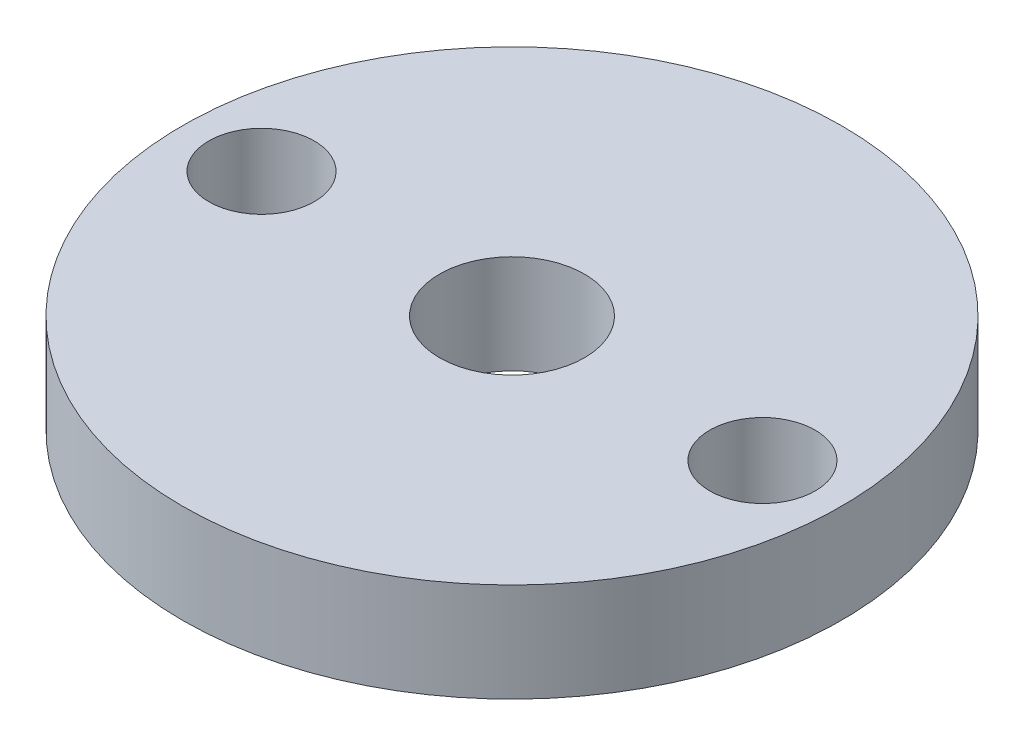
ISO-10303-21;
HEADER;
FILE_DESCRIPTION(('STEP AP214'),'2;1');
FILE_NAME('part.step','',(''),(''),'','','');
FILE_SCHEMA(('AUTOMOTIVE_DESIGN { 1 0 10303 214 1 1 1 1 }'));
ENDSEC;
DATA;
#1=APPLICATION_CONTEXT('core data for automotive mechanical design processes');
#2=APPLICATION_PROTOCOL_DEFINITION('international standard','automotive_design',2000,#1);
#3=PRODUCT_CONTEXT('',#1,'mechanical');
#4=PRODUCT('Part','Part','',(#3));
#5=PRODUCT_RELATED_PRODUCT_CATEGORY('part','',(#4));
#6=PRODUCT_DEFINITION_FORMATION('','',#4);
#7=PRODUCT_DEFINITION_CONTEXT('part definition',#1,'design');
#8=PRODUCT_DEFINITION('design','',#6,#7);
#9=PRODUCT_DEFINITION_SHAPE('','',#8);
#10=(LENGTH_UNIT() NAMED_UNIT(*) SI_UNIT(.MILLI.,.METRE.));
#11=(NAMED_UNIT(*) PLANE_ANGLE_UNIT() SI_UNIT($,.RADIAN.));
#12=(NAMED_UNIT(*) SI_UNIT($,.STERADIAN.) SOLID_ANGLE_UNIT());
#13=UNCERTAINTY_MEASURE_WITH_UNIT(LENGTH_MEASURE(1.E-05),#10,'distance_accuracy_value','');
#14=(GEOMETRIC_REPRESENTATION_CONTEXT(3) GLOBAL_UNCERTAINTY_ASSIGNED_CONTEXT((#13)) GLOBAL_UNIT_ASSIGNED_CONTEXT((#10,
#11,#12)) REPRESENTATION_CONTEXT('',''));
#15=CARTESIAN_POINT('',(0.,0.,0.));
#16=DIRECTION('',(0.,0.,1.));
#17=DIRECTION('',(1.,0.,0.));
#18=AXIS2_PLACEMENT_3D('',#15,#16,#17);
#19=CARTESIAN_POINT('',(-19.,7.5,0.));
#20=DIRECTION('',(0.,-1.,0.));
#21=DIRECTION('',(0.,0.,-1.));
#22=AXIS2_PLACEMENT_3D('',#19,#20,#21);
#23=CYLINDRICAL_SURFACE('',#22,1.8);
#24=CARTESIAN_POINT('',(-19.,0.,0.));
#25=DIRECTION('',(0.,1.,0.));
#26=DIRECTION('',(0.,0.,1.));
#27=AXIS2_PLACEMENT_3D('',#24,#25,#26);
#28=CIRCLE('',#27,1.8);
#29=CARTESIAN_POINT('',(-19.,0.,1.8));
#30=VERTEX_POINT('',#29);
#31=EDGE_CURVE('E58',#30,#30,#28,.T.);
#32=ORIENTED_EDGE('',*,*,#31,.F.);
#33=EDGE_LOOP('',(#32));
#34=FACE_BOUND('',#33,.T.);
#35=CARTESIAN_POINT('',(-19.,1.5,0.));
#36=DIRECTION('',(0.,1.,0.));
#37=DIRECTION('',(0.,0.,1.));
#38=AXIS2_PLACEMENT_3D('',#35,#36,#37);
#39=CIRCLE('',#38,1.8);
#40=CARTESIAN_POINT('',(-19.,1.5,1.8));
#41=VERTEX_POINT('',#40);
#42=EDGE_CURVE('E47',#41,#41,#39,.T.);
#43=ORIENTED_EDGE('',*,*,#42,.T.);
#44=EDGE_LOOP('',(#43));
#45=FACE_BOUND('',#44,.T.);
#46=ADVANCED_FACE('F43',(#34,#45),#23,.F.);
#47=CARTESIAN_POINT('',(19.,7.5,0.));
#48=DIRECTION('',(0.,-1.,0.));
#49=DIRECTION('',(0.,0.,-1.));
#50=AXIS2_PLACEMENT_3D('',#47,#48,#49);
#51=CYLINDRICAL_SURFACE('',#50,1.8);
#52=CARTESIAN_POINT('',(19.,0.,0.));
#53=DIRECTION('',(0.,1.,0.));
#54=DIRECTION('',(0.,0.,-1.));
#55=AXIS2_PLACEMENT_3D('',#52,#53,#54);
#56=CIRCLE('',#55,1.8);
#57=CARTESIAN_POINT('',(19.,0.,-1.80000000000001));
#58=VERTEX_POINT('',#57);
#59=EDGE_CURVE('E93',#58,#58,#56,.T.);
#60=ORIENTED_EDGE('',*,*,#59,.F.);
#61=EDGE_LOOP('',(#60));
#62=FACE_BOUND('',#61,.T.);
#63=CARTESIAN_POINT('',(19.,1.5,0.));
#64=DIRECTION('',(0.,1.,0.));
#65=DIRECTION('',(0.,0.,1.));
#66=AXIS2_PLACEMENT_3D('',#63,#64,#65);
#67=CIRCLE('',#66,1.8);
#68=CARTESIAN_POINT('',(19.,1.5,1.8));
#69=VERTEX_POINT('',#68);
#70=EDGE_CURVE('E62',#69,#69,#67,.T.);
#71=ORIENTED_EDGE('',*,*,#70,.T.);
#72=EDGE_LOOP('',(#71));
#73=FACE_BOUND('',#72,.T.);
#74=ADVANCED_FACE('F108',(#62,#73),#51,.F.);
#75=CARTESIAN_POINT('',(0.,7.5,0.));
#76=DIRECTION('',(0.,1.,0.));
#77=DIRECTION('',(0.,0.,1.));
#78=AXIS2_PLACEMENT_3D('',#75,#76,#77);
#79=PLANE('',#78);
#80=CARTESIAN_POINT('',(-19.,7.5,0.));
#81=DIRECTION('',(0.,1.,0.));
#82=DIRECTION('',(0.,0.,1.));
#83=AXIS2_PLACEMENT_3D('',#80,#81,#82);
#84=CIRCLE('',#83,4.);
#85=CARTESIAN_POINT('',(-19.,7.5,4.));
#86=VERTEX_POINT('',#85);
#87=EDGE_CURVE('E73',#86,#86,#84,.T.);
#88=ORIENTED_EDGE('',*,*,#87,.F.);
#89=EDGE_LOOP('',(#88));
#90=FACE_BOUND('',#89,.T.);
#91=CARTESIAN_POINT('',(19.,7.5,0.));
#92=DIRECTION('',(0.,1.,0.));
#93=DIRECTION('',(0.,0.,1.));
#94=AXIS2_PLACEMENT_3D('',#91,#92,#93);
#95=CIRCLE('',#94,4.);
#96=CARTESIAN_POINT('',(19.,7.5,3.99999999999999));
#97=VERTEX_POINT('',#96);
#98=EDGE_CURVE('E79',#97,#97,#95,.T.);
#99=ORIENTED_EDGE('',*,*,#98,.F.);
#100=EDGE_LOOP('',(#99));
#101=FACE_BOUND('',#100,.T.);
#102=CARTESIAN_POINT('',(0.,7.5,0.));
#103=DIRECTION('',(0.,1.,0.));
#104=DIRECTION('',(0.,0.,1.));
#105=AXIS2_PLACEMENT_3D('',#102,#103,#104);
#106=CIRCLE('',#105,25.);
#107=CARTESIAN_POINT('',(0.,7.5,25.));
#108=VERTEX_POINT('',#107);
#109=EDGE_CURVE('E10',#108,#108,#106,.T.);
#110=ORIENTED_EDGE('',*,*,#109,.T.);
#111=EDGE_LOOP('',(#110));
#112=FACE_BOUND('',#111,.T.);
#113=CARTESIAN_POINT('',(0.,7.5,0.));
#114=DIRECTION('',(0.,1.,0.));
#115=DIRECTION('',(0.,0.,1.));
#116=AXIS2_PLACEMENT_3D('',#113,#114,#115);
#117=CIRCLE('',#116,5.5);
#118=CARTESIAN_POINT('',(0.,7.5,5.5));
#119=VERTEX_POINT('',#118);
#120=EDGE_CURVE('E89',#119,#119,#117,.T.);
#121=ORIENTED_EDGE('',*,*,#120,.F.);
#122=EDGE_LOOP('',(#121));
#123=FACE_BOUND('',#122,.T.);
#124=ADVANCED_FACE('F135',(#90,#101,#112,#123),#79,.T.);
#125=CARTESIAN_POINT('',(0.,0.,0.));
#126=DIRECTION('',(0.,1.,0.));
#127=DIRECTION('',(0.,0.,1.));
#128=AXIS2_PLACEMENT_3D('',#125,#126,#127);
#129=PLANE('',#128);
#130=CARTESIAN_POINT('',(0.,0.,0.));
#131=DIRECTION('',(0.,1.,0.));
#132=DIRECTION('',(0.,0.,1.));
#133=AXIS2_PLACEMENT_3D('',#130,#131,#132);
#134=CIRCLE('',#133,25.);
#135=CARTESIAN_POINT('',(0.,0.,25.));
#136=VERTEX_POINT('',#135);
#137=EDGE_CURVE('E52',#136,#136,#134,.T.);
#138=ORIENTED_EDGE('',*,*,#137,.F.);
#139=EDGE_LOOP('',(#138));
#140=FACE_BOUND('',#139,.T.);
#141=ORIENTED_EDGE('',*,*,#31,.T.);
#142=EDGE_LOOP('',(#141));
#143=FACE_BOUND('',#142,.T.);
#144=ORIENTED_EDGE('',*,*,#59,.T.);
#145=EDGE_LOOP('',(#144));
#146=FACE_BOUND('',#145,.T.);
#147=CARTESIAN_POINT('',(0.,0.,0.));
#148=DIRECTION('',(0.,1.,0.));
#149=DIRECTION('',(0.,0.,1.));
#150=AXIS2_PLACEMENT_3D('',#147,#148,#149);
#151=CIRCLE('',#150,5.5);
#152=CARTESIAN_POINT('',(0.,0.,5.5));
#153=VERTEX_POINT('',#152);
#154=EDGE_CURVE('E71',#153,#153,#151,.T.);
#155=ORIENTED_EDGE('',*,*,#154,.T.);
#156=EDGE_LOOP('',(#155));
#157=FACE_BOUND('',#156,.T.);
#158=ADVANCED_FACE('F104',(#140,#143,#146,#157),#129,.F.);
#159=CARTESIAN_POINT('',(0.,7.5,0.));
#160=DIRECTION('',(0.,-1.,0.));
#161=DIRECTION('',(0.,0.,-1.));
#162=AXIS2_PLACEMENT_3D('',#159,#160,#161);
#163=CYLINDRICAL_SURFACE('',#162,25.);
#164=ORIENTED_EDGE('',*,*,#109,.F.);
#165=EDGE_LOOP('',(#164));
#166=FACE_BOUND('',#165,.T.);
#167=ORIENTED_EDGE('',*,*,#137,.T.);
#168=EDGE_LOOP('',(#167));
#169=FACE_BOUND('',#168,.T.);
#170=ADVANCED_FACE('F45',(#166,#169),#163,.T.);
#171=CARTESIAN_POINT('',(0.,7.5,0.));
#172=DIRECTION('',(0.,-1.,0.));
#173=DIRECTION('',(0.,0.,-1.));
#174=AXIS2_PLACEMENT_3D('',#171,#172,#173);
#175=CYLINDRICAL_SURFACE('',#174,5.5);
#176=ORIENTED_EDGE('',*,*,#120,.T.);
#177=EDGE_LOOP('',(#176));
#178=FACE_BOUND('',#177,.T.);
#179=ORIENTED_EDGE('',*,*,#154,.F.);
#180=EDGE_LOOP('',(#179));
#181=FACE_BOUND('',#180,.T.);
#182=ADVANCED_FACE('F126',(#178,#181),#175,.F.);
#183=CARTESIAN_POINT('',(19.,1.5,0.));
#184=DIRECTION('',(0.,1.,0.));
#185=DIRECTION('',(0.,0.,1.));
#186=AXIS2_PLACEMENT_3D('',#183,#184,#185);
#187=CYLINDRICAL_SURFACE('',#186,4.);
#188=CARTESIAN_POINT('',(19.,1.5,0.));
#189=DIRECTION('',(0.,1.,0.));
#190=DIRECTION('',(0.,0.,1.));
#191=AXIS2_PLACEMENT_3D('',#188,#189,#190);
#192=CIRCLE('',#191,4.);
#193=CARTESIAN_POINT('',(19.,1.5,3.99999999999999));
#194=VERTEX_POINT('',#193);
#195=EDGE_CURVE('E85',#194,#194,#192,.T.);
#196=ORIENTED_EDGE('',*,*,#195,.F.);
#197=EDGE_LOOP('',(#196));
#198=FACE_BOUND('',#197,.T.);
#199=ORIENTED_EDGE('',*,*,#98,.T.);
#200=EDGE_LOOP('',(#199));
#201=FACE_BOUND('',#200,.T.);
#202=ADVANCED_FACE('F123',(#198,#201),#187,.F.);
#203=CARTESIAN_POINT('',(19.,1.5,0.));
#204=DIRECTION('',(0.,1.,0.));
#205=DIRECTION('',(0.,0.,1.));
#206=AXIS2_PLACEMENT_3D('',#203,#204,#205);
#207=PLANE('',#206);
#208=ORIENTED_EDGE('',*,*,#70,.F.);
#209=EDGE_LOOP('',(#208));
#210=FACE_BOUND('',#209,.T.);
#211=ORIENTED_EDGE('',*,*,#195,.T.);
#212=EDGE_LOOP('',(#211));
#213=FACE_BOUND('',#212,.T.);
#214=ADVANCED_FACE('F119',(#210,#213),#207,.T.);
#215=CARTESIAN_POINT('',(-19.,1.5,0.));
#216=DIRECTION('',(0.,1.,0.));
#217=DIRECTION('',(0.,0.,1.));
#218=AXIS2_PLACEMENT_3D('',#215,#216,#217);
#219=CYLINDRICAL_SURFACE('',#218,4.);
#220=CARTESIAN_POINT('',(-19.,1.5,0.));
#221=DIRECTION('',(0.,1.,0.));
#222=DIRECTION('',(0.,0.,1.));
#223=AXIS2_PLACEMENT_3D('',#220,#221,#222);
#224=CIRCLE('',#223,4.);
#225=CARTESIAN_POINT('',(-19.,1.5,4.));
#226=VERTEX_POINT('',#225);
#227=EDGE_CURVE('E65',#226,#226,#224,.T.);
#228=ORIENTED_EDGE('',*,*,#227,.F.);
#229=EDGE_LOOP('',(#228));
#230=FACE_BOUND('',#229,.T.);
#231=ORIENTED_EDGE('',*,*,#87,.T.);
#232=EDGE_LOOP('',(#231));
#233=FACE_BOUND('',#232,.T.);
#234=ADVANCED_FACE('F114',(#230,#233),#219,.F.);
#235=CARTESIAN_POINT('',(-19.,1.5,0.));
#236=DIRECTION('',(0.,1.,0.));
#237=DIRECTION('',(0.,0.,1.));
#238=AXIS2_PLACEMENT_3D('',#235,#236,#237);
#239=PLANE('',#238);
#240=ORIENTED_EDGE('',*,*,#42,.F.);
#241=EDGE_LOOP('',(#240));
#242=FACE_BOUND('',#241,.T.);
#243=ORIENTED_EDGE('',*,*,#227,.T.);
#244=EDGE_LOOP('',(#243));
#245=FACE_BOUND('',#244,.T.);
#246=ADVANCED_FACE('F112',(#242,#245),#239,.T.);
#247=CLOSED_SHELL('',(#46,#74,#124,#158,#170,#182,#202,#214,#234,#246));
#248=MANIFOLD_SOLID_BREP('B2',#247);
#249=ADVANCED_BREP_SHAPE_REPRESENTATION('',(#18,#248),#14);
#250=SHAPE_DEFINITION_REPRESENTATION(#9,#249);
ENDSEC;
END-ISO-10303-21;
